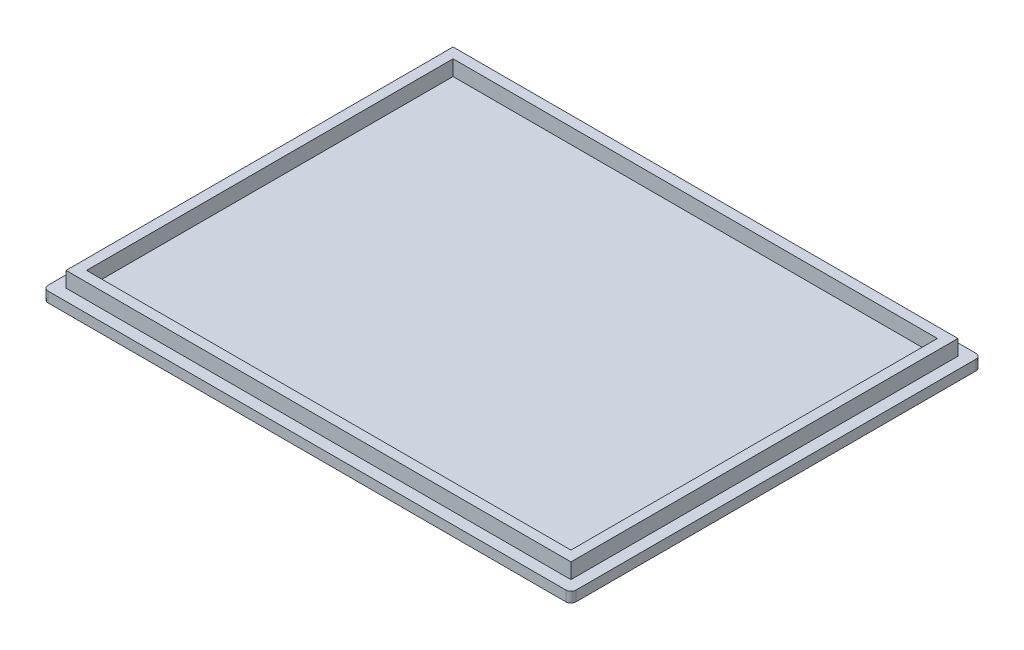
ISO-10303-21;
HEADER;
FILE_DESCRIPTION(('STEP AP214'),'2;1');
FILE_NAME('part.step','',(''),(''),'','','');
FILE_SCHEMA(('AUTOMOTIVE_DESIGN { 1 0 10303 214 1 1 1 1 }'));
ENDSEC;
DATA;
#1=APPLICATION_CONTEXT('core data for automotive mechanical design processes');
#2=APPLICATION_PROTOCOL_DEFINITION('international standard','automotive_design',2000,#1);
#3=PRODUCT_CONTEXT('',#1,'mechanical');
#4=PRODUCT('Part','Part','',(#3));
#5=PRODUCT_RELATED_PRODUCT_CATEGORY('part','',(#4));
#6=PRODUCT_DEFINITION_FORMATION('','',#4);
#7=PRODUCT_DEFINITION_CONTEXT('part definition',#1,'design');
#8=PRODUCT_DEFINITION('design','',#6,#7);
#9=PRODUCT_DEFINITION_SHAPE('','',#8);
#10=(LENGTH_UNIT() NAMED_UNIT(*) SI_UNIT(.MILLI.,.METRE.));
#11=(NAMED_UNIT(*) PLANE_ANGLE_UNIT() SI_UNIT($,.RADIAN.));
#12=(NAMED_UNIT(*) SI_UNIT($,.STERADIAN.) SOLID_ANGLE_UNIT());
#13=UNCERTAINTY_MEASURE_WITH_UNIT(LENGTH_MEASURE(1.E-05),#10,'distance_accuracy_value','');
#14=(GEOMETRIC_REPRESENTATION_CONTEXT(3) GLOBAL_UNCERTAINTY_ASSIGNED_CONTEXT((#13)) GLOBAL_UNIT_ASSIGNED_CONTEXT((#10,
#11,#12)) REPRESENTATION_CONTEXT('',''));
#15=CARTESIAN_POINT('',(0.,0.,0.));
#16=DIRECTION('',(0.,0.,1.));
#17=DIRECTION('',(1.,0.,0.));
#18=AXIS2_PLACEMENT_3D('',#15,#16,#17);
#19=CARTESIAN_POINT('',(0.,5.08,0.));
#20=DIRECTION('',(0.,-1.,0.));
#21=DIRECTION('',(0.,0.,-1.));
#22=AXIS2_PLACEMENT_3D('',#19,#20,#21);
#23=PLANE('',#22);
#24=DIRECTION('',(0.,0.,-1.));
#25=VECTOR('',#24,1.);
#26=CARTESIAN_POINT('',(261.62,5.08,0.));
#27=LINE('',#26,#25);
#28=CARTESIAN_POINT('',(261.62,5.08,-2.54));
#29=VERTEX_POINT('',#28);
#30=CARTESIAN_POINT('',(261.62,5.08,-200.66));
#31=VERTEX_POINT('',#30);
#32=EDGE_CURVE('E265',#29,#31,#27,.T.);
#33=ORIENTED_EDGE('',*,*,#32,.T.);
#34=CARTESIAN_POINT('',(259.08,5.08,-200.66));
#35=DIRECTION('',(0.,-1.,0.));
#36=DIRECTION('',(0.,0.,-1.));
#37=AXIS2_PLACEMENT_3D('',#34,#35,#36);
#38=CIRCLE('',#37,2.54);
#39=CARTESIAN_POINT('',(259.08,5.08,-203.2));
#40=VERTEX_POINT('',#39);
#41=EDGE_CURVE('E320',#31,#40,#38,.F.);
#42=ORIENTED_EDGE('',*,*,#41,.T.);
#43=DIRECTION('',(-1.,0.,0.));
#44=VECTOR('',#43,1.);
#45=CARTESIAN_POINT('',(0.,5.08,-203.2));
#46=LINE('',#45,#44);
#47=CARTESIAN_POINT('',(2.54,5.08,-203.2));
#48=VERTEX_POINT('',#47);
#49=EDGE_CURVE('E269',#40,#48,#46,.T.);
#50=ORIENTED_EDGE('',*,*,#49,.T.);
#51=CARTESIAN_POINT('',(2.54,5.08,-200.66));
#52=DIRECTION('',(0.,-1.,0.));
#53=DIRECTION('',(0.,0.,-1.));
#54=AXIS2_PLACEMENT_3D('',#51,#52,#53);
#55=CIRCLE('',#54,2.54);
#56=CARTESIAN_POINT('',(0.,5.08,-200.66));
#57=VERTEX_POINT('',#56);
#58=EDGE_CURVE('E317',#48,#57,#55,.F.);
#59=ORIENTED_EDGE('',*,*,#58,.T.);
#60=DIRECTION('',(0.,0.,1.));
#61=VECTOR('',#60,1.);
#62=CARTESIAN_POINT('',(0.,5.08,0.));
#63=LINE('',#62,#61);
#64=CARTESIAN_POINT('',(0.,5.08,-2.54));
#65=VERTEX_POINT('',#64);
#66=EDGE_CURVE('E258',#57,#65,#63,.T.);
#67=ORIENTED_EDGE('',*,*,#66,.T.);
#68=CARTESIAN_POINT('',(2.54,5.08,-2.54));
#69=DIRECTION('',(0.,-1.,0.));
#70=DIRECTION('',(0.,0.,-1.));
#71=AXIS2_PLACEMENT_3D('',#68,#69,#70);
#72=CIRCLE('',#71,2.54);
#73=CARTESIAN_POINT('',(2.54,5.08,0.));
#74=VERTEX_POINT('',#73);
#75=EDGE_CURVE('E65',#65,#74,#72,.F.);
#76=ORIENTED_EDGE('',*,*,#75,.T.);
#77=DIRECTION('',(1.,0.,0.));
#78=VECTOR('',#77,1.);
#79=CARTESIAN_POINT('',(0.,5.08,0.));
#80=LINE('',#79,#78);
#81=CARTESIAN_POINT('',(259.08,5.08,0.));
#82=VERTEX_POINT('',#81);
#83=EDGE_CURVE('E261',#74,#82,#80,.T.);
#84=ORIENTED_EDGE('',*,*,#83,.T.);
#85=CARTESIAN_POINT('',(259.08,5.08,-2.54));
#86=DIRECTION('',(0.,-1.,0.));
#87=DIRECTION('',(0.,0.,-1.));
#88=AXIS2_PLACEMENT_3D('',#85,#86,#87);
#89=CIRCLE('',#88,2.54);
#90=EDGE_CURVE('E312',#82,#29,#89,.F.);
#91=ORIENTED_EDGE('',*,*,#90,.T.);
#92=EDGE_LOOP('',(#33,#42,#50,#59,#67,#76,#84,#91));
#93=FACE_BOUND('',#92,.T.);
#94=DIRECTION('',(0.,0.,1.));
#95=VECTOR('',#94,1.);
#96=CARTESIAN_POINT('',(5.715,5.08,-197.485));
#97=LINE('',#96,#95);
#98=CARTESIAN_POINT('',(5.715,5.08,-197.485));
#99=VERTEX_POINT('',#98);
#100=CARTESIAN_POINT('',(5.71500000000002,5.08,-5.715));
#101=VERTEX_POINT('',#100);
#102=EDGE_CURVE('E179',#99,#101,#97,.T.);
#103=ORIENTED_EDGE('',*,*,#102,.F.);
#104=DIRECTION('',(-1.,0.,0.));
#105=VECTOR('',#104,1.);
#106=CARTESIAN_POINT('',(5.715,5.08,-197.485));
#107=LINE('',#106,#105);
#108=CARTESIAN_POINT('',(255.905,5.08,-197.485));
#109=VERTEX_POINT('',#108);
#110=EDGE_CURVE('E218',#109,#99,#107,.T.);
#111=ORIENTED_EDGE('',*,*,#110,.F.);
#112=DIRECTION('',(0.,0.,-1.));
#113=VECTOR('',#112,1.);
#114=CARTESIAN_POINT('',(255.905,5.08,-197.485));
#115=LINE('',#114,#113);
#116=CARTESIAN_POINT('',(255.905,5.08,-5.715));
#117=VERTEX_POINT('',#116);
#118=EDGE_CURVE('E235',#117,#109,#115,.T.);
#119=ORIENTED_EDGE('',*,*,#118,.F.);
#120=DIRECTION('',(1.,0.,0.));
#121=VECTOR('',#120,1.);
#122=CARTESIAN_POINT('',(5.71500000000002,5.08,-5.715));
#123=LINE('',#122,#121);
#124=EDGE_CURVE('E231',#101,#117,#123,.T.);
#125=ORIENTED_EDGE('',*,*,#124,.F.);
#126=EDGE_LOOP('',(#103,#111,#119,#125));
#127=FACE_BOUND('',#126,.T.);
#128=ADVANCED_FACE('F43',(#93,#127),#23,.F.);
#129=CARTESIAN_POINT('',(0.,5.08,0.));
#130=DIRECTION('',(1.,0.,0.));
#131=DIRECTION('',(0.,0.,-1.));
#132=AXIS2_PLACEMENT_3D('',#129,#130,#131);
#133=PLANE('',#132);
#134=ORIENTED_EDGE('',*,*,#66,.F.);
#135=DIRECTION('',(0.,-1.,0.));
#136=VECTOR('',#135,1.);
#137=CARTESIAN_POINT('',(0.,5.08,-200.66));
#138=LINE('',#137,#136);
#139=CARTESIAN_POINT('',(0.,0.,-200.66));
#140=VERTEX_POINT('',#139);
#141=EDGE_CURVE('E326',#57,#140,#138,.T.);
#142=ORIENTED_EDGE('',*,*,#141,.T.);
#143=DIRECTION('',(0.,0.,1.));
#144=VECTOR('',#143,1.);
#145=CARTESIAN_POINT('',(0.,0.,0.));
#146=LINE('',#145,#144);
#147=CARTESIAN_POINT('',(0.,0.,-2.54));
#148=VERTEX_POINT('',#147);
#149=EDGE_CURVE('E257',#140,#148,#146,.T.);
#150=ORIENTED_EDGE('',*,*,#149,.T.);
#151=DIRECTION('',(0.,-1.,0.));
#152=VECTOR('',#151,1.);
#153=CARTESIAN_POINT('',(0.,5.08,-2.54));
#154=LINE('',#153,#152);
#155=EDGE_CURVE('E323',#148,#65,#154,.F.);
#156=ORIENTED_EDGE('',*,*,#155,.T.);
#157=EDGE_LOOP('',(#134,#142,#150,#156));
#158=FACE_BOUND('',#157,.T.);
#159=ADVANCED_FACE('F334',(#158),#133,.F.);
#160=CARTESIAN_POINT('',(0.,5.08,0.));
#161=DIRECTION('',(0.,0.,-1.));
#162=DIRECTION('',(-1.,0.,0.));
#163=AXIS2_PLACEMENT_3D('',#160,#161,#162);
#164=PLANE('',#163);
#165=ORIENTED_EDGE('',*,*,#83,.F.);
#166=DIRECTION('',(0.,-1.,0.));
#167=VECTOR('',#166,1.);
#168=CARTESIAN_POINT('',(2.54,5.08,0.));
#169=LINE('',#168,#167);
#170=CARTESIAN_POINT('',(2.54,0.,0.));
#171=VERTEX_POINT('',#170);
#172=EDGE_CURVE('E11',#74,#171,#169,.T.);
#173=ORIENTED_EDGE('',*,*,#172,.T.);
#174=DIRECTION('',(1.,0.,0.));
#175=VECTOR('',#174,1.);
#176=CARTESIAN_POINT('',(0.,0.,0.));
#177=LINE('',#176,#175);
#178=CARTESIAN_POINT('',(259.08,0.,0.));
#179=VERTEX_POINT('',#178);
#180=EDGE_CURVE('E277',#171,#179,#177,.T.);
#181=ORIENTED_EDGE('',*,*,#180,.T.);
#182=DIRECTION('',(0.,-1.,0.));
#183=VECTOR('',#182,1.);
#184=CARTESIAN_POINT('',(259.08,5.08,0.));
#185=LINE('',#184,#183);
#186=EDGE_CURVE('E52',#179,#82,#185,.F.);
#187=ORIENTED_EDGE('',*,*,#186,.T.);
#188=EDGE_LOOP('',(#165,#173,#181,#187));
#189=FACE_BOUND('',#188,.T.);
#190=ADVANCED_FACE('F345',(#189),#164,.F.);
#191=CARTESIAN_POINT('',(261.62,5.08,0.));
#192=DIRECTION('',(-1.,0.,0.));
#193=DIRECTION('',(0.,0.,1.));
#194=AXIS2_PLACEMENT_3D('',#191,#192,#193);
#195=PLANE('',#194);
#196=DIRECTION('',(0.,0.,-1.));
#197=VECTOR('',#196,1.);
#198=CARTESIAN_POINT('',(261.62,0.,0.));
#199=LINE('',#198,#197);
#200=CARTESIAN_POINT('',(261.62,0.,-2.54));
#201=VERTEX_POINT('',#200);
#202=CARTESIAN_POINT('',(261.62,0.,-200.66));
#203=VERTEX_POINT('',#202);
#204=EDGE_CURVE('E280',#201,#203,#199,.T.);
#205=ORIENTED_EDGE('',*,*,#204,.T.);
#206=DIRECTION('',(0.,-1.,0.));
#207=VECTOR('',#206,1.);
#208=CARTESIAN_POINT('',(261.62,5.08,-200.66));
#209=LINE('',#208,#207);
#210=EDGE_CURVE('E309',#203,#31,#209,.F.);
#211=ORIENTED_EDGE('',*,*,#210,.T.);
#212=ORIENTED_EDGE('',*,*,#32,.F.);
#213=DIRECTION('',(0.,-1.,0.));
#214=VECTOR('',#213,1.);
#215=CARTESIAN_POINT('',(261.62,5.08,-2.54));
#216=LINE('',#215,#214);
#217=EDGE_CURVE('E305',#29,#201,#216,.T.);
#218=ORIENTED_EDGE('',*,*,#217,.T.);
#219=EDGE_LOOP('',(#205,#211,#212,#218));
#220=FACE_BOUND('',#219,.T.);
#221=ADVANCED_FACE('F353',(#220),#195,.F.);
#222=CARTESIAN_POINT('',(0.,5.08,-203.2));
#223=DIRECTION('',(0.,0.,1.));
#224=DIRECTION('',(1.,0.,0.));
#225=AXIS2_PLACEMENT_3D('',#222,#223,#224);
#226=PLANE('',#225);
#227=ORIENTED_EDGE('',*,*,#49,.F.);
#228=DIRECTION('',(0.,-1.,0.));
#229=VECTOR('',#228,1.);
#230=CARTESIAN_POINT('',(259.08,5.08,-203.2));
#231=LINE('',#230,#229);
#232=CARTESIAN_POINT('',(259.08,0.,-203.2));
#233=VERTEX_POINT('',#232);
#234=EDGE_CURVE('E289',#40,#233,#231,.T.);
#235=ORIENTED_EDGE('',*,*,#234,.T.);
#236=DIRECTION('',(-1.,0.,0.));
#237=VECTOR('',#236,1.);
#238=CARTESIAN_POINT('',(0.,0.,-203.2));
#239=LINE('',#238,#237);
#240=CARTESIAN_POINT('',(2.54,0.,-203.2));
#241=VERTEX_POINT('',#240);
#242=EDGE_CURVE('E262',#233,#241,#239,.T.);
#243=ORIENTED_EDGE('',*,*,#242,.T.);
#244=DIRECTION('',(0.,-1.,0.));
#245=VECTOR('',#244,1.);
#246=CARTESIAN_POINT('',(2.54,5.08,-203.2));
#247=LINE('',#246,#245);
#248=EDGE_CURVE('E273',#241,#48,#247,.F.);
#249=ORIENTED_EDGE('',*,*,#248,.T.);
#250=EDGE_LOOP('',(#227,#235,#243,#249));
#251=FACE_BOUND('',#250,.T.);
#252=ADVANCED_FACE('F361',(#251),#226,.F.);
#253=CARTESIAN_POINT('',(0.,0.,0.));
#254=DIRECTION('',(0.,-1.,0.));
#255=DIRECTION('',(0.,0.,-1.));
#256=AXIS2_PLACEMENT_3D('',#253,#254,#255);
#257=PLANE('',#256);
#258=ORIENTED_EDGE('',*,*,#242,.F.);
#259=CARTESIAN_POINT('',(259.08,0.,-200.66));
#260=DIRECTION('',(0.,-1.,0.));
#261=DIRECTION('',(0.,0.,-1.));
#262=AXIS2_PLACEMENT_3D('',#259,#260,#261);
#263=CIRCLE('',#262,2.54);
#264=EDGE_CURVE('E302',#233,#203,#263,.T.);
#265=ORIENTED_EDGE('',*,*,#264,.T.);
#266=ORIENTED_EDGE('',*,*,#204,.F.);
#267=CARTESIAN_POINT('',(259.08,0.,-2.54));
#268=DIRECTION('',(0.,-1.,0.));
#269=DIRECTION('',(0.,0.,-1.));
#270=AXIS2_PLACEMENT_3D('',#267,#268,#269);
#271=CIRCLE('',#270,2.54);
#272=EDGE_CURVE('E293',#201,#179,#271,.T.);
#273=ORIENTED_EDGE('',*,*,#272,.T.);
#274=ORIENTED_EDGE('',*,*,#180,.F.);
#275=CARTESIAN_POINT('',(2.54,0.,-2.54));
#276=DIRECTION('',(0.,-1.,0.));
#277=DIRECTION('',(0.,0.,-1.));
#278=AXIS2_PLACEMENT_3D('',#275,#276,#277);
#279=CIRCLE('',#278,2.54);
#280=EDGE_CURVE('E296',#171,#148,#279,.T.);
#281=ORIENTED_EDGE('',*,*,#280,.T.);
#282=ORIENTED_EDGE('',*,*,#149,.F.);
#283=CARTESIAN_POINT('',(2.54,0.,-200.66));
#284=DIRECTION('',(0.,-1.,0.));
#285=DIRECTION('',(0.,0.,-1.));
#286=AXIS2_PLACEMENT_3D('',#283,#284,#285);
#287=CIRCLE('',#286,2.54);
#288=EDGE_CURVE('E299',#140,#241,#287,.T.);
#289=ORIENTED_EDGE('',*,*,#288,.T.);
#290=EDGE_LOOP('',(#258,#265,#266,#273,#274,#281,#282,#289));
#291=FACE_BOUND('',#290,.T.);
#292=ADVANCED_FACE('F340',(#291),#257,.T.);
#293=CARTESIAN_POINT('',(0.,12.7,0.));
#294=DIRECTION('',(0.,1.,0.));
#295=DIRECTION('',(0.,0.,1.));
#296=AXIS2_PLACEMENT_3D('',#293,#294,#295);
#297=PLANE('',#296);
#298=DIRECTION('',(0.,0.,1.));
#299=VECTOR('',#298,1.);
#300=CARTESIAN_POINT('',(5.715,12.7,-197.485));
#301=LINE('',#300,#299);
#302=CARTESIAN_POINT('',(5.715,12.7,-197.485));
#303=VERTEX_POINT('',#302);
#304=CARTESIAN_POINT('',(5.71500000000002,12.7,-5.715));
#305=VERTEX_POINT('',#304);
#306=EDGE_CURVE('E213',#303,#305,#301,.T.);
#307=ORIENTED_EDGE('',*,*,#306,.T.);
#308=DIRECTION('',(1.,0.,0.));
#309=VECTOR('',#308,1.);
#310=CARTESIAN_POINT('',(5.71500000000002,12.7,-5.715));
#311=LINE('',#310,#309);
#312=CARTESIAN_POINT('',(255.905,12.7,-5.715));
#313=VERTEX_POINT('',#312);
#314=EDGE_CURVE('E217',#305,#313,#311,.T.);
#315=ORIENTED_EDGE('',*,*,#314,.T.);
#316=DIRECTION('',(0.,0.,-1.));
#317=VECTOR('',#316,1.);
#318=CARTESIAN_POINT('',(255.905,12.7,-197.485));
#319=LINE('',#318,#317);
#320=CARTESIAN_POINT('',(255.905,12.7,-197.485));
#321=VERTEX_POINT('',#320);
#322=EDGE_CURVE('E221',#313,#321,#319,.T.);
#323=ORIENTED_EDGE('',*,*,#322,.T.);
#324=DIRECTION('',(-1.,0.,0.));
#325=VECTOR('',#324,1.);
#326=CARTESIAN_POINT('',(5.715,12.7,-197.485));
#327=LINE('',#326,#325);
#328=EDGE_CURVE('E224',#321,#303,#327,.T.);
#329=ORIENTED_EDGE('',*,*,#328,.T.);
#330=EDGE_LOOP('',(#307,#315,#323,#329));
#331=FACE_BOUND('',#330,.T.);
#332=DIRECTION('',(1.,0.,0.));
#333=VECTOR('',#332,1.);
#334=CARTESIAN_POINT('',(10.795,12.7,-10.795));
#335=LINE('',#334,#333);
#336=CARTESIAN_POINT('',(10.795,12.7,-10.795));
#337=VERTEX_POINT('',#336);
#338=CARTESIAN_POINT('',(250.825,12.7,-10.795));
#339=VERTEX_POINT('',#338);
#340=EDGE_CURVE('E170',#337,#339,#335,.T.);
#341=ORIENTED_EDGE('',*,*,#340,.F.);
#342=DIRECTION('',(0.,0.,1.));
#343=VECTOR('',#342,1.);
#344=CARTESIAN_POINT('',(10.795,12.7,-192.405));
#345=LINE('',#344,#343);
#346=CARTESIAN_POINT('',(10.795,12.7,-192.405));
#347=VERTEX_POINT('',#346);
#348=EDGE_CURVE('E159',#347,#337,#345,.T.);
#349=ORIENTED_EDGE('',*,*,#348,.F.);
#350=DIRECTION('',(-1.,0.,0.));
#351=VECTOR('',#350,1.);
#352=CARTESIAN_POINT('',(10.795,12.7,-192.405));
#353=LINE('',#352,#351);
#354=CARTESIAN_POINT('',(250.825,12.7,-192.405));
#355=VERTEX_POINT('',#354);
#356=EDGE_CURVE('E189',#355,#347,#353,.T.);
#357=ORIENTED_EDGE('',*,*,#356,.F.);
#358=DIRECTION('',(0.,0.,-1.));
#359=VECTOR('',#358,1.);
#360=CARTESIAN_POINT('',(250.825,12.7,-192.405));
#361=LINE('',#360,#359);
#362=EDGE_CURVE('E185',#339,#355,#361,.T.);
#363=ORIENTED_EDGE('',*,*,#362,.F.);
#364=EDGE_LOOP('',(#341,#349,#357,#363));
#365=FACE_BOUND('',#364,.T.);
#366=ADVANCED_FACE('F183',(#331,#365),#297,.T.);
#367=CARTESIAN_POINT('',(5.715,12.7,-197.485));
#368=DIRECTION('',(1.,0.,0.));
#369=DIRECTION('',(0.,0.,-1.));
#370=AXIS2_PLACEMENT_3D('',#367,#368,#369);
#371=PLANE('',#370);
#372=ORIENTED_EDGE('',*,*,#102,.T.);
#373=DIRECTION('',(0.,-1.,0.));
#374=VECTOR('',#373,1.);
#375=CARTESIAN_POINT('',(5.71500000000002,12.7,-5.715));
#376=LINE('',#375,#374);
#377=EDGE_CURVE('E253',#305,#101,#376,.T.);
#378=ORIENTED_EDGE('',*,*,#377,.F.);
#379=ORIENTED_EDGE('',*,*,#306,.F.);
#380=DIRECTION('',(0.,-1.,0.));
#381=VECTOR('',#380,1.);
#382=CARTESIAN_POINT('',(5.715,12.7,-197.485));
#383=LINE('',#382,#381);
#384=EDGE_CURVE('E227',#303,#99,#383,.T.);
#385=ORIENTED_EDGE('',*,*,#384,.T.);
#386=EDGE_LOOP('',(#372,#378,#379,#385));
#387=FACE_BOUND('',#386,.T.);
#388=ADVANCED_FACE('F405',(#387),#371,.F.);
#389=CARTESIAN_POINT('',(5.71500000000002,12.7,-5.715));
#390=DIRECTION('',(0.,0.,-1.));
#391=DIRECTION('',(-1.,0.,0.));
#392=AXIS2_PLACEMENT_3D('',#389,#390,#391);
#393=PLANE('',#392);
#394=ORIENTED_EDGE('',*,*,#124,.T.);
#395=DIRECTION('',(0.,-1.,0.));
#396=VECTOR('',#395,1.);
#397=CARTESIAN_POINT('',(255.905,12.7,-5.715));
#398=LINE('',#397,#396);
#399=EDGE_CURVE('E249',#313,#117,#398,.T.);
#400=ORIENTED_EDGE('',*,*,#399,.F.);
#401=ORIENTED_EDGE('',*,*,#314,.F.);
#402=ORIENTED_EDGE('',*,*,#377,.T.);
#403=EDGE_LOOP('',(#394,#400,#401,#402));
#404=FACE_BOUND('',#403,.T.);
#405=ADVANCED_FACE('F413',(#404),#393,.F.);
#406=CARTESIAN_POINT('',(255.905,12.7,-197.485));
#407=DIRECTION('',(-1.,0.,0.));
#408=DIRECTION('',(0.,0.,1.));
#409=AXIS2_PLACEMENT_3D('',#406,#407,#408);
#410=PLANE('',#409);
#411=ORIENTED_EDGE('',*,*,#118,.T.);
#412=DIRECTION('',(0.,-1.,0.));
#413=VECTOR('',#412,1.);
#414=CARTESIAN_POINT('',(255.905,12.7,-197.485));
#415=LINE('',#414,#413);
#416=EDGE_CURVE('E245',#321,#109,#415,.T.);
#417=ORIENTED_EDGE('',*,*,#416,.F.);
#418=ORIENTED_EDGE('',*,*,#322,.F.);
#419=ORIENTED_EDGE('',*,*,#399,.T.);
#420=EDGE_LOOP('',(#411,#417,#418,#419));
#421=FACE_BOUND('',#420,.T.);
#422=ADVANCED_FACE('F409',(#421),#410,.F.);
#423=CARTESIAN_POINT('',(5.715,12.7,-197.485));
#424=DIRECTION('',(0.,0.,1.));
#425=DIRECTION('',(1.,0.,0.));
#426=AXIS2_PLACEMENT_3D('',#423,#424,#425);
#427=PLANE('',#426);
#428=ORIENTED_EDGE('',*,*,#110,.T.);
#429=ORIENTED_EDGE('',*,*,#384,.F.);
#430=ORIENTED_EDGE('',*,*,#328,.F.);
#431=ORIENTED_EDGE('',*,*,#416,.T.);
#432=EDGE_LOOP('',(#428,#429,#430,#431));
#433=FACE_BOUND('',#432,.T.);
#434=ADVANCED_FACE('F402',(#433),#427,.F.);
#435=CARTESIAN_POINT('',(10.795,12.7,-192.405));
#436=DIRECTION('',(1.,0.,0.));
#437=DIRECTION('',(0.,0.,-1.));
#438=AXIS2_PLACEMENT_3D('',#435,#436,#437);
#439=PLANE('',#438);
#440=DIRECTION('',(0.,0.,1.));
#441=VECTOR('',#440,1.);
#442=CARTESIAN_POINT('',(10.795,5.08,-192.405));
#443=LINE('',#442,#441);
#444=CARTESIAN_POINT('',(10.795,5.08,-192.405));
#445=VERTEX_POINT('',#444);
#446=CARTESIAN_POINT('',(10.795,5.08,-10.795));
#447=VERTEX_POINT('',#446);
#448=EDGE_CURVE('E194',#445,#447,#443,.T.);
#449=ORIENTED_EDGE('',*,*,#448,.F.);
#450=DIRECTION('',(0.,-1.,0.));
#451=VECTOR('',#450,1.);
#452=CARTESIAN_POINT('',(10.795,12.7,-192.405));
#453=LINE('',#452,#451);
#454=EDGE_CURVE('E165',#347,#445,#453,.T.);
#455=ORIENTED_EDGE('',*,*,#454,.F.);
#456=ORIENTED_EDGE('',*,*,#348,.T.);
#457=DIRECTION('',(0.,-1.,0.));
#458=VECTOR('',#457,1.);
#459=CARTESIAN_POINT('',(10.795,12.7,-10.795));
#460=LINE('',#459,#458);
#461=EDGE_CURVE('E163',#337,#447,#460,.T.);
#462=ORIENTED_EDGE('',*,*,#461,.T.);
#463=EDGE_LOOP('',(#449,#455,#456,#462));
#464=FACE_BOUND('',#463,.T.);
#465=ADVANCED_FACE('F162',(#464),#439,.T.);
#466=CARTESIAN_POINT('',(10.795,12.7,-10.795));
#467=DIRECTION('',(0.,0.,-1.));
#468=DIRECTION('',(-1.,0.,0.));
#469=AXIS2_PLACEMENT_3D('',#466,#467,#468);
#470=PLANE('',#469);
#471=DIRECTION('',(1.,0.,0.));
#472=VECTOR('',#471,1.);
#473=CARTESIAN_POINT('',(10.795,5.08,-10.795));
#474=LINE('',#473,#472);
#475=CARTESIAN_POINT('',(250.825,5.08,-10.795));
#476=VERTEX_POINT('',#475);
#477=EDGE_CURVE('E177',#447,#476,#474,.T.);
#478=ORIENTED_EDGE('',*,*,#477,.F.);
#479=ORIENTED_EDGE('',*,*,#461,.F.);
#480=ORIENTED_EDGE('',*,*,#340,.T.);
#481=DIRECTION('',(0.,-1.,0.));
#482=VECTOR('',#481,1.);
#483=CARTESIAN_POINT('',(250.825,12.7,-10.795));
#484=LINE('',#483,#482);
#485=EDGE_CURVE('E180',#339,#476,#484,.T.);
#486=ORIENTED_EDGE('',*,*,#485,.T.);
#487=EDGE_LOOP('',(#478,#479,#480,#486));
#488=FACE_BOUND('',#487,.T.);
#489=ADVANCED_FACE('F174',(#488),#470,.T.);
#490=CARTESIAN_POINT('',(250.825,12.7,-192.405));
#491=DIRECTION('',(-1.,0.,0.));
#492=DIRECTION('',(0.,0.,1.));
#493=AXIS2_PLACEMENT_3D('',#490,#491,#492);
#494=PLANE('',#493);
#495=DIRECTION('',(0.,0.,-1.));
#496=VECTOR('',#495,1.);
#497=CARTESIAN_POINT('',(250.825,5.08,-192.405));
#498=LINE('',#497,#496);
#499=CARTESIAN_POINT('',(250.825,5.08,-192.405));
#500=VERTEX_POINT('',#499);
#501=EDGE_CURVE('E199',#476,#500,#498,.T.);
#502=ORIENTED_EDGE('',*,*,#501,.F.);
#503=ORIENTED_EDGE('',*,*,#485,.F.);
#504=ORIENTED_EDGE('',*,*,#362,.T.);
#505=DIRECTION('',(0.,-1.,0.));
#506=VECTOR('',#505,1.);
#507=CARTESIAN_POINT('',(250.825,12.7,-192.405));
#508=LINE('',#507,#506);
#509=EDGE_CURVE('E208',#355,#500,#508,.T.);
#510=ORIENTED_EDGE('',*,*,#509,.T.);
#511=EDGE_LOOP('',(#502,#503,#504,#510));
#512=FACE_BOUND('',#511,.T.);
#513=ADVANCED_FACE('F387',(#512),#494,.T.);
#514=CARTESIAN_POINT('',(10.795,12.7,-192.405));
#515=DIRECTION('',(0.,0.,1.));
#516=DIRECTION('',(1.,0.,0.));
#517=AXIS2_PLACEMENT_3D('',#514,#515,#516);
#518=PLANE('',#517);
#519=DIRECTION('',(-1.,0.,0.));
#520=VECTOR('',#519,1.);
#521=CARTESIAN_POINT('',(10.795,5.08,-192.405));
#522=LINE('',#521,#520);
#523=EDGE_CURVE('E171',#500,#445,#522,.T.);
#524=ORIENTED_EDGE('',*,*,#523,.F.);
#525=ORIENTED_EDGE('',*,*,#509,.F.);
#526=ORIENTED_EDGE('',*,*,#356,.T.);
#527=ORIENTED_EDGE('',*,*,#454,.T.);
#528=EDGE_LOOP('',(#524,#525,#526,#527));
#529=FACE_BOUND('',#528,.T.);
#530=ADVANCED_FACE('F381',(#529),#518,.T.);
#531=ORIENTED_EDGE('',*,*,#523,.T.);
#532=ORIENTED_EDGE('',*,*,#448,.T.);
#533=ORIENTED_EDGE('',*,*,#477,.T.);
#534=ORIENTED_EDGE('',*,*,#501,.T.);
#535=EDGE_LOOP('',(#531,#532,#533,#534));
#536=FACE_BOUND('',#535,.T.);
#537=ADVANCED_FACE('F370',(#536),#23,.F.);
#538=CARTESIAN_POINT('',(259.08,5.08,-200.66));
#539=DIRECTION('',(0.,-1.,0.));
#540=DIRECTION('',(0.,0.,-1.));
#541=AXIS2_PLACEMENT_3D('',#538,#539,#540);
#542=CYLINDRICAL_SURFACE('',#541,2.54);
#543=ORIENTED_EDGE('',*,*,#41,.F.);
#544=ORIENTED_EDGE('',*,*,#210,.F.);
#545=ORIENTED_EDGE('',*,*,#264,.F.);
#546=ORIENTED_EDGE('',*,*,#234,.F.);
#547=EDGE_LOOP('',(#543,#544,#545,#546));
#548=FACE_BOUND('',#547,.T.);
#549=ADVANCED_FACE('F358',(#548),#542,.T.);
#550=CARTESIAN_POINT('',(2.54,5.08,-200.66));
#551=DIRECTION('',(0.,-1.,0.));
#552=DIRECTION('',(0.,0.,-1.));
#553=AXIS2_PLACEMENT_3D('',#550,#551,#552);
#554=CYLINDRICAL_SURFACE('',#553,2.54);
#555=ORIENTED_EDGE('',*,*,#58,.F.);
#556=ORIENTED_EDGE('',*,*,#248,.F.);
#557=ORIENTED_EDGE('',*,*,#288,.F.);
#558=ORIENTED_EDGE('',*,*,#141,.F.);
#559=EDGE_LOOP('',(#555,#556,#557,#558));
#560=FACE_BOUND('',#559,.T.);
#561=ADVANCED_FACE('F363',(#560),#554,.T.);
#562=CARTESIAN_POINT('',(2.54,5.08,-2.54));
#563=DIRECTION('',(0.,-1.,0.));
#564=DIRECTION('',(0.,0.,-1.));
#565=AXIS2_PLACEMENT_3D('',#562,#563,#564);
#566=CYLINDRICAL_SURFACE('',#565,2.54);
#567=ORIENTED_EDGE('',*,*,#75,.F.);
#568=ORIENTED_EDGE('',*,*,#155,.F.);
#569=ORIENTED_EDGE('',*,*,#280,.F.);
#570=ORIENTED_EDGE('',*,*,#172,.F.);
#571=EDGE_LOOP('',(#567,#568,#569,#570));
#572=FACE_BOUND('',#571,.T.);
#573=ADVANCED_FACE('F344',(#572),#566,.T.);
#574=CARTESIAN_POINT('',(259.08,5.08,-2.54));
#575=DIRECTION('',(0.,-1.,0.));
#576=DIRECTION('',(0.,0.,-1.));
#577=AXIS2_PLACEMENT_3D('',#574,#575,#576);
#578=CYLINDRICAL_SURFACE('',#577,2.54);
#579=ORIENTED_EDGE('',*,*,#90,.F.);
#580=ORIENTED_EDGE('',*,*,#186,.F.);
#581=ORIENTED_EDGE('',*,*,#272,.F.);
#582=ORIENTED_EDGE('',*,*,#217,.F.);
#583=EDGE_LOOP('',(#579,#580,#581,#582));
#584=FACE_BOUND('',#583,.T.);
#585=ADVANCED_FACE('F45',(#584),#578,.T.);
#586=CLOSED_SHELL('',(#128,#159,#190,#221,#252,#292,#366,#388,#405,#422,#434,#465,#489,#513,
#530,#537,#549,#561,#573,#585));
#587=MANIFOLD_SOLID_BREP('B2',#586);
#588=ADVANCED_BREP_SHAPE_REPRESENTATION('',(#18,#587),#14);
#589=SHAPE_DEFINITION_REPRESENTATION(#9,#588);
ENDSEC;
END-ISO-10303-21;
